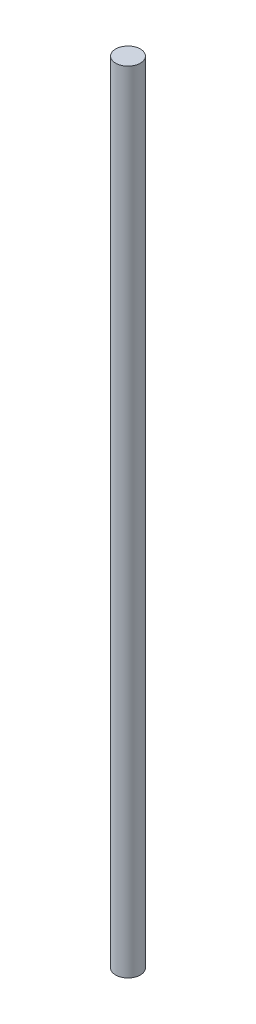
ISO-10303-21;
HEADER;
FILE_DESCRIPTION(('STEP AP214'),'2;1');
FILE_NAME('part.step','',(''),(''),'','','');
FILE_SCHEMA(('AUTOMOTIVE_DESIGN { 1 0 10303 214 1 1 1 1 }'));
ENDSEC;
DATA;
#1=APPLICATION_CONTEXT('core data for automotive mechanical design processes');
#2=APPLICATION_PROTOCOL_DEFINITION('international standard','automotive_design',2000,#1);
#3=PRODUCT_CONTEXT('',#1,'mechanical');
#4=PRODUCT('Part','Part','',(#3));
#5=PRODUCT_RELATED_PRODUCT_CATEGORY('part','',(#4));
#6=PRODUCT_DEFINITION_FORMATION('','',#4);
#7=PRODUCT_DEFINITION_CONTEXT('part definition',#1,'design');
#8=PRODUCT_DEFINITION('design','',#6,#7);
#9=PRODUCT_DEFINITION_SHAPE('','',#8);
#10=(LENGTH_UNIT() NAMED_UNIT(*) SI_UNIT(.MILLI.,.METRE.));
#11=(NAMED_UNIT(*) PLANE_ANGLE_UNIT() SI_UNIT($,.RADIAN.));
#12=(NAMED_UNIT(*) SI_UNIT($,.STERADIAN.) SOLID_ANGLE_UNIT());
#13=UNCERTAINTY_MEASURE_WITH_UNIT(LENGTH_MEASURE(1.E-05),#10,'distance_accuracy_value','');
#14=(GEOMETRIC_REPRESENTATION_CONTEXT(3) GLOBAL_UNCERTAINTY_ASSIGNED_CONTEXT((#13)) GLOBAL_UNIT_ASSIGNED_CONTEXT((#10,
#11,#12)) REPRESENTATION_CONTEXT('',''));
#15=CARTESIAN_POINT('',(0.,0.,0.));
#16=DIRECTION('',(0.,0.,1.));
#17=DIRECTION('',(1.,0.,0.));
#18=AXIS2_PLACEMENT_3D('',#15,#16,#17);
#19=CARTESIAN_POINT('',(0.,160.,0.));
#20=DIRECTION('',(0.,-1.,0.));
#21=DIRECTION('',(0.,0.,-1.));
#22=AXIS2_PLACEMENT_3D('',#19,#20,#21);
#23=CYLINDRICAL_SURFACE('',#22,2.5);
#24=CARTESIAN_POINT('',(0.,160.,0.));
#25=DIRECTION('',(0.,1.,0.));
#26=DIRECTION('',(0.,0.,1.));
#27=AXIS2_PLACEMENT_3D('',#24,#25,#26);
#28=CIRCLE('',#27,2.5);
#29=CARTESIAN_POINT('',(0.,160.,2.5));
#30=VERTEX_POINT('',#29);
#31=EDGE_CURVE('E10',#30,#30,#28,.T.);
#32=ORIENTED_EDGE('',*,*,#31,.F.);
#33=EDGE_LOOP('',(#32));
#34=FACE_BOUND('',#33,.T.);
#35=CARTESIAN_POINT('',(0.,0.,0.));
#36=DIRECTION('',(0.,1.,0.));
#37=DIRECTION('',(0.,0.,1.));
#38=AXIS2_PLACEMENT_3D('',#35,#36,#37);
#39=CIRCLE('',#38,2.5);
#40=CARTESIAN_POINT('',(0.,0.,2.5));
#41=VERTEX_POINT('',#40);
#42=EDGE_CURVE('E35',#41,#41,#39,.T.);
#43=ORIENTED_EDGE('',*,*,#42,.T.);
#44=EDGE_LOOP('',(#43));
#45=FACE_BOUND('',#44,.T.);
#46=ADVANCED_FACE('F32',(#34,#45),#23,.T.);
#47=CARTESIAN_POINT('',(0.,160.,0.));
#48=DIRECTION('',(0.,1.,0.));
#49=DIRECTION('',(0.,0.,1.));
#50=AXIS2_PLACEMENT_3D('',#47,#48,#49);
#51=PLANE('',#50);
#52=ORIENTED_EDGE('',*,*,#31,.T.);
#53=EDGE_LOOP('',(#52));
#54=FACE_BOUND('',#53,.T.);
#55=ADVANCED_FACE('F47',(#54),#51,.T.);
#56=CARTESIAN_POINT('',(0.,0.,0.));
#57=DIRECTION('',(0.,1.,0.));
#58=DIRECTION('',(0.,0.,1.));
#59=AXIS2_PLACEMENT_3D('',#56,#57,#58);
#60=PLANE('',#59);
#61=ORIENTED_EDGE('',*,*,#42,.F.);
#62=EDGE_LOOP('',(#61));
#63=FACE_BOUND('',#62,.T.);
#64=ADVANCED_FACE('F45',(#63),#60,.F.);
#65=CLOSED_SHELL('',(#46,#55,#64));
#66=MANIFOLD_SOLID_BREP('B2',#65);
#67=ADVANCED_BREP_SHAPE_REPRESENTATION('',(#18,#66),#14);
#68=SHAPE_DEFINITION_REPRESENTATION(#9,#67);
ENDSEC;
END-ISO-10303-21;
